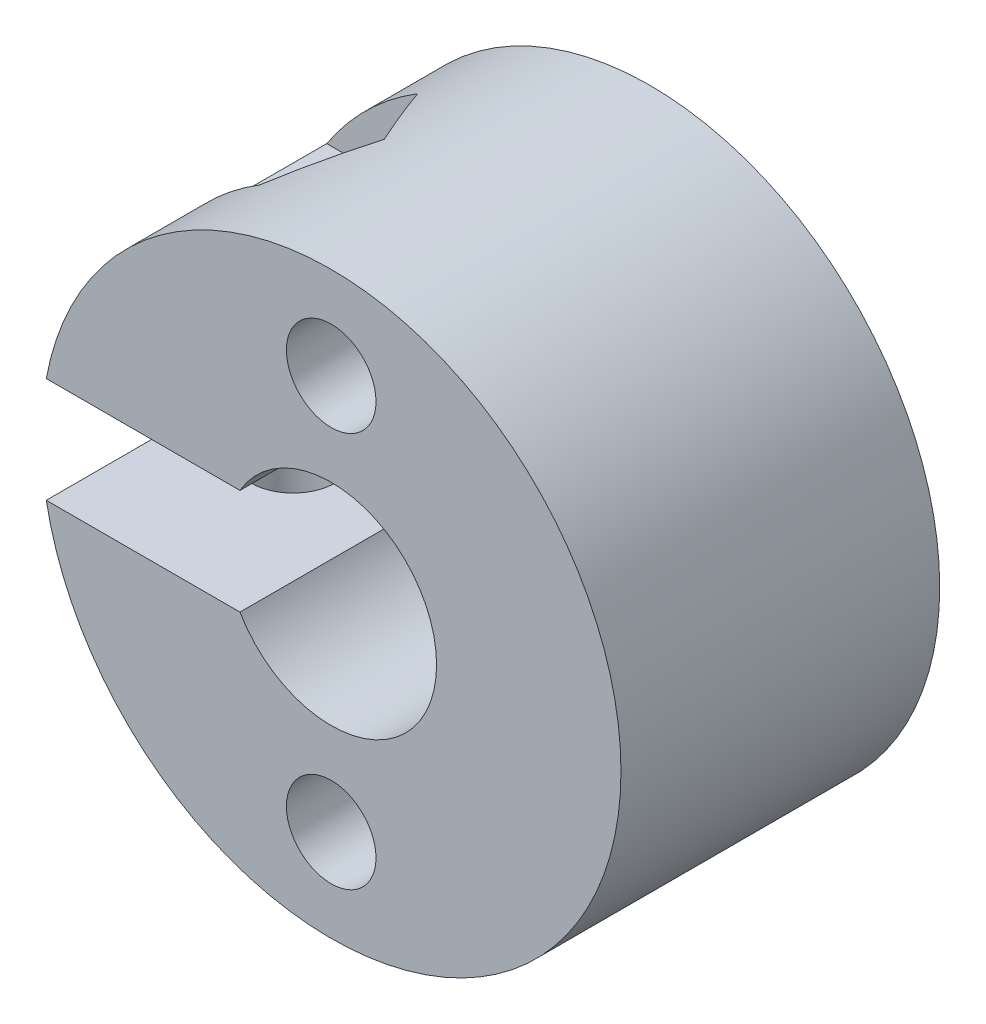
ISO-10303-21;
HEADER;
FILE_DESCRIPTION(('STEP AP214'),'2;1');
FILE_NAME('part.step','',(''),(''),'','','');
FILE_SCHEMA(('AUTOMOTIVE_DESIGN { 1 0 10303 214 1 1 1 1 }'));
ENDSEC;
DATA;
#1=APPLICATION_CONTEXT('core data for automotive mechanical design processes');
#2=APPLICATION_PROTOCOL_DEFINITION('international standard','automotive_design',2000,#1);
#3=PRODUCT_CONTEXT('',#1,'mechanical');
#4=PRODUCT('Part','Part','',(#3));
#5=PRODUCT_RELATED_PRODUCT_CATEGORY('part','',(#4));
#6=PRODUCT_DEFINITION_FORMATION('','',#4);
#7=PRODUCT_DEFINITION_CONTEXT('part definition',#1,'design');
#8=PRODUCT_DEFINITION('design','',#6,#7);
#9=PRODUCT_DEFINITION_SHAPE('','',#8);
#10=(LENGTH_UNIT() NAMED_UNIT(*) SI_UNIT(.MILLI.,.METRE.));
#11=(NAMED_UNIT(*) PLANE_ANGLE_UNIT() SI_UNIT($,.RADIAN.));
#12=(NAMED_UNIT(*) SI_UNIT($,.STERADIAN.) SOLID_ANGLE_UNIT());
#13=UNCERTAINTY_MEASURE_WITH_UNIT(LENGTH_MEASURE(1.E-05),#10,'distance_accuracy_value','');
#14=(GEOMETRIC_REPRESENTATION_CONTEXT(3) GLOBAL_UNCERTAINTY_ASSIGNED_CONTEXT((#13)) GLOBAL_UNIT_ASSIGNED_CONTEXT((#10,
#11,#12)) REPRESENTATION_CONTEXT('',''));
#15=CARTESIAN_POINT('',(0.,0.,0.));
#16=DIRECTION('',(0.,0.,1.));
#17=DIRECTION('',(1.,0.,0.));
#18=AXIS2_PLACEMENT_3D('',#15,#16,#17);
#19=CARTESIAN_POINT('',(0.,0.,6.05));
#20=DIRECTION('',(0.,0.,-1.));
#21=DIRECTION('',(-1.,0.,0.));
#22=AXIS2_PLACEMENT_3D('',#19,#20,#21);
#23=CYLINDRICAL_SURFACE('',#22,11.);
#24=CARTESIAN_POINT('',(0.,0.,-6.99038105676657));
#25=DIRECTION('',(0.866025403784438,0.,0.500000000000001));
#26=DIRECTION('',(0.500000000000001,0.,-0.866025403784438));
#27=AXIS2_PLACEMENT_3D('',#24,#25,#26);
#28=ELLIPSE('',#27,22.,11.);
#29=CARTESIAN_POINT('',(-4.03589838486225,10.2328649080825,0.));
#30=VERTEX_POINT('',#29);
#31=CARTESIAN_POINT('',(-5.76794919243113,9.36647009889708,3.));
#32=VERTEX_POINT('',#31);
#33=EDGE_CURVE('E45',#30,#32,#28,.T.);
#34=ORIENTED_EDGE('',*,*,#33,.T.);
#35=CARTESIAN_POINT('',(0.,0.,3.));
#36=DIRECTION('',(0.,0.,1.));
#37=DIRECTION('',(1.,0.,0.));
#38=AXIS2_PLACEMENT_3D('',#35,#36,#37);
#39=CIRCLE('',#38,11.);
#40=CARTESIAN_POINT('',(-9.21954445729289,6.,3.));
#41=VERTEX_POINT('',#40);
#42=EDGE_CURVE('E11',#32,#41,#39,.T.);
#43=ORIENTED_EDGE('',*,*,#42,.T.);
#44=DIRECTION('',(0.,0.,-1.));
#45=VECTOR('',#44,1.);
#46=CARTESIAN_POINT('',(-9.21954445729289,6.,6.05));
#47=LINE('',#46,#45);
#48=CARTESIAN_POINT('',(-9.21954445729289,6.,-3.));
#49=VERTEX_POINT('',#48);
#50=EDGE_CURVE('E138',#41,#49,#47,.T.);
#51=ORIENTED_EDGE('',*,*,#50,.T.);
#52=CARTESIAN_POINT('',(0.,0.,-3.));
#53=DIRECTION('',(0.,0.,-1.));
#54=DIRECTION('',(-1.,0.,0.));
#55=AXIS2_PLACEMENT_3D('',#52,#53,#54);
#56=CIRCLE('',#55,11.);
#57=CARTESIAN_POINT('',(-5.76794919243112,9.36647009889708,-3.));
#58=VERTEX_POINT('',#57);
#59=EDGE_CURVE('E121',#49,#58,#56,.T.);
#60=ORIENTED_EDGE('',*,*,#59,.T.);
#61=CARTESIAN_POINT('',(0.,0.,6.99038105676659));
#62=DIRECTION('',(0.866025403784439,0.,-0.5));
#63=DIRECTION('',(-0.5,0.,-0.866025403784439));
#64=AXIS2_PLACEMENT_3D('',#61,#62,#63);
#65=ELLIPSE('',#64,22.,11.);
#66=EDGE_CURVE('E114',#58,#30,#65,.T.);
#67=ORIENTED_EDGE('',*,*,#66,.T.);
#68=EDGE_LOOP('',(#34,#43,#51,#60,#67));
#69=FACE_BOUND('',#68,.T.);
#70=CARTESIAN_POINT('',(0.,0.,-6.05));
#71=DIRECTION('',(0.,0.,1.));
#72=DIRECTION('',(1.,0.,0.));
#73=AXIS2_PLACEMENT_3D('',#70,#71,#72);
#74=CIRCLE('',#73,11.);
#75=CARTESIAN_POINT('',(-10.816653826392,-2.,-6.05));
#76=VERTEX_POINT('',#75);
#77=CARTESIAN_POINT('',(-10.816653826392,2.,-6.05));
#78=VERTEX_POINT('',#77);
#79=EDGE_CURVE('E178',#76,#78,#74,.T.);
#80=ORIENTED_EDGE('',*,*,#79,.T.);
#81=DIRECTION('',(0.,0.,-1.));
#82=VECTOR('',#81,1.);
#83=CARTESIAN_POINT('',(-10.816653826392,2.,6.05));
#84=LINE('',#83,#82);
#85=CARTESIAN_POINT('',(-10.816653826392,2.,6.05));
#86=VERTEX_POINT('',#85);
#87=EDGE_CURVE('E183',#86,#78,#84,.T.);
#88=ORIENTED_EDGE('',*,*,#87,.F.);
#89=CARTESIAN_POINT('',(0.,0.,6.05));
#90=DIRECTION('',(0.,0.,1.));
#91=DIRECTION('',(1.,0.,0.));
#92=AXIS2_PLACEMENT_3D('',#89,#90,#91);
#93=CIRCLE('',#92,11.);
#94=CARTESIAN_POINT('',(-10.816653826392,-2.,6.05));
#95=VERTEX_POINT('',#94);
#96=EDGE_CURVE('E168',#95,#86,#93,.T.);
#97=ORIENTED_EDGE('',*,*,#96,.F.);
#98=DIRECTION('',(0.,0.,-1.));
#99=VECTOR('',#98,1.);
#100=CARTESIAN_POINT('',(-10.816653826392,-2.,6.05));
#101=LINE('',#100,#99);
#102=EDGE_CURVE('E186',#95,#76,#101,.T.);
#103=ORIENTED_EDGE('',*,*,#102,.T.);
#104=EDGE_LOOP('',(#80,#88,#97,#103));
#105=FACE_BOUND('',#104,.T.);
#106=CARTESIAN_POINT('',(-9.21954445729289,-6.,-2.45828534946481));
#107=CARTESIAN_POINT('',(-9.16962369434284,-6.07670838822272,-2.49319914837598));
#108=CARTESIAN_POINT('',(-9.11846097288012,-6.15322954997117,-2.52672792055324));
#109=CARTESIAN_POINT('',(-9.01363326079193,-6.30578962097701,-2.59088731650166));
#110=CARTESIAN_POINT('',(-8.95996788693253,-6.38182845433626,-2.62151749421803));
#111=CARTESIAN_POINT('',(-8.79492353272957,-6.60942473448226,-2.70900633348126));
#112=CARTESIAN_POINT('',(-8.67976009867826,-6.76005514058467,-2.76127726455125));
#113=CARTESIAN_POINT('',(-8.43810874825098,-7.05944452733029,-2.85251234749427));
#114=CARTESIAN_POINT('',(-8.31150003565628,-7.20815840092392,-2.89130675590342));
#115=CARTESIAN_POINT('',(-8.04889237043635,-7.50025960626798,-2.95243626562761));
#116=CARTESIAN_POINT('',(-7.91290610561974,-7.64365374649872,-2.97479314687432));
#117=CARTESIAN_POINT('',(-7.60258257874723,-7.95350250591399,-3.00309496073762));
#118=CARTESIAN_POINT('',(-7.42621388634796,-8.11842628589439,-3.00457296913705));
#119=CARTESIAN_POINT('',(-7.1555040531597,-8.35542719544604,-2.98152245214718));
#120=CARTESIAN_POINT('',(-7.06440911402104,-8.43256840696948,-2.96967117161582));
#121=CARTESIAN_POINT('',(-6.88077342278933,-8.58306804930493,-2.93688113199226));
#122=CARTESIAN_POINT('',(-6.78823293183919,-8.65642715329895,-2.91594399639386));
#123=CARTESIAN_POINT('',(-6.54200670910777,-8.8452968450835,-2.84736931550023));
#124=CARTESIAN_POINT('',(-6.38770294522396,-8.957186475267,-2.7912226934624));
#125=CARTESIAN_POINT('',(-6.1592549468863,-9.11439762455724,-2.68504973063589));
#126=CARTESIAN_POINT('',(-6.08354939344028,-9.16506592569123,-2.64596108280181));
#127=CARTESIAN_POINT('',(-5.93398163716762,-9.2626020755329,-2.5602735315391));
#128=CARTESIAN_POINT('',(-5.86011851003812,-9.30947185753941,-2.51367848511796));
#129=CARTESIAN_POINT('',(-5.71453819156496,-9.39954529803598,-2.41247862539532));
#130=CARTESIAN_POINT('',(-5.64284445033294,-9.44271457476713,-2.35780936522533));
#131=CARTESIAN_POINT('',(-5.5033182306326,-9.52470637523183,-2.24087935260187));
#132=CARTESIAN_POINT('',(-5.43548380769459,-9.56353109762215,-2.17862247366111));
#133=CARTESIAN_POINT('',(-5.30471648830957,-9.63667977622062,-2.04678951605906));
#134=CARTESIAN_POINT('',(-5.24178188743467,-9.67100530036345,-1.97721600250212));
#135=CARTESIAN_POINT('',(-5.1218362220198,-9.73506126870522,-1.8311908778656));
#136=CARTESIAN_POINT('',(-5.06482414251262,-9.76479250067438,-1.75474044951573));
#137=CARTESIAN_POINT('',(-4.96521231878609,-9.81577027607118,-1.60675355043185));
#138=CARTESIAN_POINT('',(-4.92171241941144,-9.83762195740379,-1.53602898576591));
#139=CARTESIAN_POINT('',(-4.84036598904372,-9.87790048429394,-1.39043259802364));
#140=CARTESIAN_POINT('',(-4.80252139352554,-9.89632615785693,-1.3155593670678));
#141=CARTESIAN_POINT('',(-4.73303669143421,-9.92974586871033,-1.16231766128789));
#142=CARTESIAN_POINT('',(-4.70139177011898,-9.94474257050634,-1.08395195728736));
#143=CARTESIAN_POINT('',(-4.64468205597193,-9.97135403585391,-0.924310682393318));
#144=CARTESIAN_POINT('',(-4.61961957086766,-9.98296761347579,-0.843034102297617));
#145=CARTESIAN_POINT('',(-4.55829422061439,-10.0111905425589,-0.608987253280262));
#146=CARTESIAN_POINT('',(-4.53028229232096,-10.0238134673388,-0.453458787378516));
#147=CARTESIAN_POINT('',(-4.49909335075869,-10.0378508590196,-0.139537649235302));
#148=CARTESIAN_POINT('',(-4.495911016331,-10.039267727459,0.0188544020260451));
#149=CARTESIAN_POINT('',(-4.5142533014835,-10.0310322063007,0.330261746704096));
#150=CARTESIAN_POINT('',(-4.53521248444752,-10.0216331494081,0.483317004425118));
#151=CARTESIAN_POINT('',(-4.6000254114755,-9.99204788726955,0.78339743154016));
#152=CARTESIAN_POINT('',(-4.64387779238082,-9.97186232429642,0.930422959407877));
#153=CARTESIAN_POINT('',(-4.75275391643018,-9.92043046478622,1.21486583274434));
#154=CARTESIAN_POINT('',(-4.81784229807742,-9.8891503728863,1.35225226736871));
#155=CARTESIAN_POINT('',(-4.96633457249534,-9.81541465728542,1.61341613678729));
#156=CARTESIAN_POINT('',(-5.04973906881889,-9.77295866530689,1.73719312292102));
#157=CARTESIAN_POINT('',(-5.23407143694858,-9.67551810805269,1.97192752401311));
#158=CARTESIAN_POINT('',(-5.33544867094766,-9.62019691227175,2.08239101186931));
#159=CARTESIAN_POINT('',(-5.54965456792145,-9.49823732049181,2.28425812245443));
#160=CARTESIAN_POINT('',(-5.66248591135079,-9.43159627298877,2.37565726844888));
#161=CARTESIAN_POINT('',(-5.90447965518244,-9.28217988126091,2.54515557869029));
#162=CARTESIAN_POINT('',(-6.03422911142344,-9.19855017896628,2.62165487661195));
#163=CARTESIAN_POINT('',(-6.2974218036384,-9.02040658894497,2.75234858377846));
#164=CARTESIAN_POINT('',(-6.43086685103741,-8.92588728920727,2.80653184046526));
#165=CARTESIAN_POINT('',(-6.65956125405633,-8.75582293555542,2.88162398532755));
#166=CARTESIAN_POINT('',(-6.75487876985067,-8.68252776166313,2.90761365881151));
#167=CARTESIAN_POINT('',(-6.94439426011574,-8.53170816218983,2.94969880929382));
#168=CARTESIAN_POINT('',(-7.03859184320766,-8.45418230813817,2.96579092163729));
#169=CARTESIAN_POINT('',(-7.22513790081673,-8.29532556127582,2.98886323729912));
#170=CARTESIAN_POINT('',(-7.31748268816114,-8.21398798438582,2.99582676275173));
#171=CARTESIAN_POINT('',(-7.49953102708978,-8.04811841569375,3.00138225655563));
#172=CARTESIAN_POINT('',(-7.58923385445976,-7.96358556223865,2.99997195054561));
#173=CARTESIAN_POINT('',(-7.79815722750525,-7.75997192436992,2.98759839188977));
#174=CARTESIAN_POINT('',(-7.91601189235662,-7.63968636285029,2.9732919772315));
#175=CARTESIAN_POINT('',(-8.14508319364219,-7.39498106502992,2.93213579965798));
#176=CARTESIAN_POINT('',(-8.25629664956186,-7.27055939162338,2.90528008028371));
#177=CARTESIAN_POINT('',(-8.47158470939219,-7.0185268366963,2.84053805203195));
#178=CARTESIAN_POINT('',(-8.57566043718832,-6.89091646159643,2.80265348467389));
#179=CARTESIAN_POINT('',(-8.77643671905504,-6.63331084674224,2.71709641632918));
#180=CARTESIAN_POINT('',(-8.8731406067424,-6.50331671833403,2.66942837596551));
#181=CARTESIAN_POINT('',(-9.0100708385558,-6.31065626236284,2.5927247193428));
#182=CARTESIAN_POINT('',(-9.05318468137214,-6.2486399815589,2.56712161040548));
#183=CARTESIAN_POINT('',(-9.13765065685103,-6.12445622512442,2.51407607063091));
#184=CARTESIAN_POINT('',(-9.17900701664316,-6.06228954289204,2.48663851586983));
#185=CARTESIAN_POINT('',(-9.21954445729289,-6.,2.45828534946483));
#186=B_SPLINE_CURVE_WITH_KNOTS('',3,(#106,#107,#108,#109,#110,#111,#112,#113,#114,#115,#116,
#117,#118,#119,#120,#121,#122,#123,#124,#125,#126,#127,#128,#129,#130,#131,#132,#133,#134,#135,
#136,#137,#138,#139,#140,#141,#142,#143,#144,#145,#146,#147,#148,#149,#150,#151,#152,#153,#154,
#155,#156,#157,#158,#159,#160,#161,#162,#163,#164,#165,#166,#167,#168,#169,#170,#171,#172,#173,
#174,#175,#176,#177,#178,#179,#180,#181,#182,#183,#184,#185),.UNSPECIFIED.,.F.,.F.,(4,2,2,2,2,2,
2,2,2,2,2,2,2,2,2,2,2,2,2,2,2,2,2,2,2,2,2,2,2,2,2,2,2,2,2,2,2,2,2,4),(0.,0.293830544857458,
0.587706233012701,1.17701105495841,1.77349006790102,2.36917730720555,3.09075390750203,
3.45026298080158,3.80970784213959,4.40296197091337,4.70004981985171,4.99698550040555,
5.29643404313603,5.59573035141063,5.89492207841636,6.19406244680553,6.45129720470754,
6.70861979816422,6.96574175263062,7.22295373117318,7.69601695406956,8.16897879336186,
8.6310844606701,9.09316261537365,9.55666058192806,10.0201738239659,10.4975452881344,
10.9750287239287,11.489866590444,12.0049614385793,12.3735467746423,12.7422573413522,
13.1116406052247,13.4811241994459,13.9873880513941,14.4938924431786,15.0003168983071,
15.5065109679393,15.7457327489761,15.9843421684413),.UNSPECIFIED.);
#187=CARTESIAN_POINT('',(-9.21954445729289,-6.,-2.45828534946481));
#188=VERTEX_POINT('',#187);
#189=CARTESIAN_POINT('',(-9.21954445729289,-6.,2.45828534946481));
#190=VERTEX_POINT('',#189);
#191=EDGE_CURVE('E190',#188,#190,#186,.T.);
#192=ORIENTED_EDGE('',*,*,#191,.F.);
#193=DIRECTION('',(0.,0.,-1.));
#194=VECTOR('',#193,1.);
#195=CARTESIAN_POINT('',(-9.21954445729289,-6.,6.05));
#196=LINE('',#195,#194);
#197=EDGE_CURVE('E142',#190,#188,#196,.T.);
#198=ORIENTED_EDGE('',*,*,#197,.F.);
#199=EDGE_LOOP('',(#192,#198));
#200=FACE_BOUND('',#199,.T.);
#201=ADVANCED_FACE('F37',(#69,#105,#200),#23,.T.);
#202=CARTESIAN_POINT('',(-7.5,-12.5,0.));
#203=DIRECTION('',(0.,1.,0.));
#204=DIRECTION('',(0.,0.,1.));
#205=AXIS2_PLACEMENT_3D('',#202,#203,#204);
#206=CYLINDRICAL_SURFACE('',#205,1.6);
#207=CARTESIAN_POINT('',(-7.5,-2.,0.));
#208=DIRECTION('',(0.,1.,0.));
#209=DIRECTION('',(0.,0.,1.));
#210=AXIS2_PLACEMENT_3D('',#207,#208,#209);
#211=CIRCLE('',#210,1.6);
#212=CARTESIAN_POINT('',(-7.5,-2.,1.6));
#213=VERTEX_POINT('',#212);
#214=EDGE_CURVE('E157',#213,#213,#211,.T.);
#215=ORIENTED_EDGE('',*,*,#214,.T.);
#216=EDGE_LOOP('',(#215));
#217=FACE_BOUND('',#216,.T.);
#218=CARTESIAN_POINT('',(-7.5,-6.,0.));
#219=DIRECTION('',(0.,-1.,0.));
#220=DIRECTION('',(0.,0.,-1.));
#221=AXIS2_PLACEMENT_3D('',#218,#219,#220);
#222=CIRCLE('',#221,1.6);
#223=CARTESIAN_POINT('',(-7.5,-6.,-1.6));
#224=VERTEX_POINT('',#223);
#225=EDGE_CURVE('E141',#224,#224,#222,.F.);
#226=ORIENTED_EDGE('',*,*,#225,.F.);
#227=EDGE_LOOP('',(#226));
#228=FACE_BOUND('',#227,.T.);
#229=ADVANCED_FACE('F222',(#217,#228),#206,.F.);
#230=CARTESIAN_POINT('',(0.,0.,6.05));
#231=DIRECTION('',(0.,0.,-1.));
#232=DIRECTION('',(-1.,0.,0.));
#233=AXIS2_PLACEMENT_3D('',#230,#231,#232);
#234=CYLINDRICAL_SURFACE('',#233,4.);
#235=CARTESIAN_POINT('',(0.,0.,-6.05));
#236=DIRECTION('',(0.,0.,1.));
#237=DIRECTION('',(1.,0.,0.));
#238=AXIS2_PLACEMENT_3D('',#235,#236,#237);
#239=CIRCLE('',#238,4.);
#240=CARTESIAN_POINT('',(-3.46410161513775,-2.,-6.05));
#241=VERTEX_POINT('',#240);
#242=CARTESIAN_POINT('',(-3.46410161513775,2.,-6.05));
#243=VERTEX_POINT('',#242);
#244=EDGE_CURVE('E160',#241,#243,#239,.T.);
#245=ORIENTED_EDGE('',*,*,#244,.F.);
#246=DIRECTION('',(0.,0.,-1.));
#247=VECTOR('',#246,1.);
#248=CARTESIAN_POINT('',(-3.46410161513775,-2.,6.05));
#249=LINE('',#248,#247);
#250=CARTESIAN_POINT('',(-3.46410161513775,-2.,6.05));
#251=VERTEX_POINT('',#250);
#252=EDGE_CURVE('E188',#251,#241,#249,.T.);
#253=ORIENTED_EDGE('',*,*,#252,.F.);
#254=CARTESIAN_POINT('',(0.,0.,6.05));
#255=DIRECTION('',(0.,0.,1.));
#256=DIRECTION('',(1.,0.,0.));
#257=AXIS2_PLACEMENT_3D('',#254,#255,#256);
#258=CIRCLE('',#257,4.);
#259=CARTESIAN_POINT('',(-3.46410161513775,2.,6.05));
#260=VERTEX_POINT('',#259);
#261=EDGE_CURVE('E161',#251,#260,#258,.T.);
#262=ORIENTED_EDGE('',*,*,#261,.T.);
#263=DIRECTION('',(0.,0.,-1.));
#264=VECTOR('',#263,1.);
#265=CARTESIAN_POINT('',(-3.46410161513775,2.,6.05));
#266=LINE('',#265,#264);
#267=EDGE_CURVE('E172',#260,#243,#266,.T.);
#268=ORIENTED_EDGE('',*,*,#267,.T.);
#269=EDGE_LOOP('',(#245,#253,#262,#268));
#270=FACE_BOUND('',#269,.T.);
#271=ADVANCED_FACE('F39',(#270),#234,.F.);
#272=CARTESIAN_POINT('',(0.,-2.,6.05));
#273=DIRECTION('',(0.,1.,0.));
#274=DIRECTION('',(0.,0.,1.));
#275=AXIS2_PLACEMENT_3D('',#272,#273,#274);
#276=PLANE('',#275);
#277=ORIENTED_EDGE('',*,*,#214,.F.);
#278=EDGE_LOOP('',(#277));
#279=FACE_BOUND('',#278,.T.);
#280=DIRECTION('',(1.,0.,0.));
#281=VECTOR('',#280,1.);
#282=CARTESIAN_POINT('',(0.,-2.,-6.05));
#283=LINE('',#282,#281);
#284=EDGE_CURVE('E175',#76,#241,#283,.T.);
#285=ORIENTED_EDGE('',*,*,#284,.F.);
#286=ORIENTED_EDGE('',*,*,#102,.F.);
#287=DIRECTION('',(1.,0.,0.));
#288=VECTOR('',#287,1.);
#289=CARTESIAN_POINT('',(0.,-2.,6.05));
#290=LINE('',#289,#288);
#291=EDGE_CURVE('E164',#95,#251,#290,.T.);
#292=ORIENTED_EDGE('',*,*,#291,.T.);
#293=ORIENTED_EDGE('',*,*,#252,.T.);
#294=EDGE_LOOP('',(#285,#286,#292,#293));
#295=FACE_BOUND('',#294,.T.);
#296=ADVANCED_FACE('F235',(#279,#295),#276,.T.);
#297=CARTESIAN_POINT('',(0.,2.,6.05));
#298=DIRECTION('',(0.,1.,0.));
#299=DIRECTION('',(0.,0.,1.));
#300=AXIS2_PLACEMENT_3D('',#297,#298,#299);
#301=PLANE('',#300);
#302=CARTESIAN_POINT('',(-7.5,2.,0.));
#303=DIRECTION('',(0.,1.,0.));
#304=DIRECTION('',(0.,0.,1.));
#305=AXIS2_PLACEMENT_3D('',#302,#303,#304);
#306=CIRCLE('',#305,1.6);
#307=CARTESIAN_POINT('',(-7.5,2.,1.6));
#308=VERTEX_POINT('',#307);
#309=EDGE_CURVE('E156',#308,#308,#306,.T.);
#310=ORIENTED_EDGE('',*,*,#309,.T.);
#311=EDGE_LOOP('',(#310));
#312=FACE_BOUND('',#311,.T.);
#313=DIRECTION('',(1.,0.,0.));
#314=VECTOR('',#313,1.);
#315=CARTESIAN_POINT('',(0.,2.,-6.05));
#316=LINE('',#315,#314);
#317=EDGE_CURVE('E165',#78,#243,#316,.T.);
#318=ORIENTED_EDGE('',*,*,#317,.T.);
#319=ORIENTED_EDGE('',*,*,#267,.F.);
#320=DIRECTION('',(1.,0.,0.));
#321=VECTOR('',#320,1.);
#322=CARTESIAN_POINT('',(0.,2.,6.05));
#323=LINE('',#322,#321);
#324=EDGE_CURVE('E170',#86,#260,#323,.T.);
#325=ORIENTED_EDGE('',*,*,#324,.F.);
#326=ORIENTED_EDGE('',*,*,#87,.T.);
#327=EDGE_LOOP('',(#318,#319,#325,#326));
#328=FACE_BOUND('',#327,.T.);
#329=ADVANCED_FACE('F230',(#312,#328),#301,.F.);
#330=CARTESIAN_POINT('',(0.,0.,6.05));
#331=DIRECTION('',(0.,0.,1.));
#332=DIRECTION('',(1.,0.,0.));
#333=AXIS2_PLACEMENT_3D('',#330,#331,#332);
#334=PLANE('',#333);
#335=CARTESIAN_POINT('',(0.,7.5,6.05));
#336=DIRECTION('',(0.,0.,1.));
#337=DIRECTION('',(1.,0.,0.));
#338=AXIS2_PLACEMENT_3D('',#335,#336,#337);
#339=CIRCLE('',#338,1.7);
#340=CARTESIAN_POINT('',(1.70000000000003,7.5,6.05));
#341=VERTEX_POINT('',#340);
#342=EDGE_CURVE('E153',#341,#341,#339,.T.);
#343=ORIENTED_EDGE('',*,*,#342,.F.);
#344=EDGE_LOOP('',(#343));
#345=FACE_BOUND('',#344,.T.);
#346=CARTESIAN_POINT('',(0.,-7.5,6.05));
#347=DIRECTION('',(0.,0.,1.));
#348=DIRECTION('',(1.,0.,0.));
#349=AXIS2_PLACEMENT_3D('',#346,#347,#348);
#350=CIRCLE('',#349,1.7);
#351=CARTESIAN_POINT('',(1.69999999999992,-7.5,6.05));
#352=VERTEX_POINT('',#351);
#353=EDGE_CURVE('E148',#352,#352,#350,.T.);
#354=ORIENTED_EDGE('',*,*,#353,.F.);
#355=EDGE_LOOP('',(#354));
#356=FACE_BOUND('',#355,.T.);
#357=ORIENTED_EDGE('',*,*,#261,.F.);
#358=ORIENTED_EDGE('',*,*,#291,.F.);
#359=ORIENTED_EDGE('',*,*,#96,.T.);
#360=ORIENTED_EDGE('',*,*,#324,.T.);
#361=EDGE_LOOP('',(#357,#358,#359,#360));
#362=FACE_BOUND('',#361,.T.);
#363=ADVANCED_FACE('F226',(#345,#356,#362),#334,.T.);
#364=CARTESIAN_POINT('',(0.,0.,-6.05));
#365=DIRECTION('',(0.,0.,1.));
#366=DIRECTION('',(1.,0.,0.));
#367=AXIS2_PLACEMENT_3D('',#364,#365,#366);
#368=PLANE('',#367);
#369=CARTESIAN_POINT('',(0.,7.5,-6.05));
#370=DIRECTION('',(0.,0.,-1.));
#371=DIRECTION('',(-1.,0.,0.));
#372=AXIS2_PLACEMENT_3D('',#369,#370,#371);
#373=CIRCLE('',#372,1.7);
#374=CARTESIAN_POINT('',(-1.69999999999997,7.5,-6.05));
#375=VERTEX_POINT('',#374);
#376=EDGE_CURVE('E145',#375,#375,#373,.T.);
#377=ORIENTED_EDGE('',*,*,#376,.F.);
#378=EDGE_LOOP('',(#377));
#379=FACE_BOUND('',#378,.T.);
#380=CARTESIAN_POINT('',(0.,-7.5,-6.05));
#381=DIRECTION('',(0.,0.,-1.));
#382=DIRECTION('',(-1.,0.,0.));
#383=AXIS2_PLACEMENT_3D('',#380,#381,#382);
#384=CIRCLE('',#383,1.7);
#385=CARTESIAN_POINT('',(-1.70000000000008,-7.5,-6.05));
#386=VERTEX_POINT('',#385);
#387=EDGE_CURVE('E144',#386,#386,#384,.T.);
#388=ORIENTED_EDGE('',*,*,#387,.F.);
#389=EDGE_LOOP('',(#388));
#390=FACE_BOUND('',#389,.T.);
#391=ORIENTED_EDGE('',*,*,#244,.T.);
#392=ORIENTED_EDGE('',*,*,#317,.F.);
#393=ORIENTED_EDGE('',*,*,#79,.F.);
#394=ORIENTED_EDGE('',*,*,#284,.T.);
#395=EDGE_LOOP('',(#391,#392,#393,#394));
#396=FACE_BOUND('',#395,.T.);
#397=ADVANCED_FACE('F229',(#379,#390,#396),#368,.F.);
#398=CARTESIAN_POINT('',(-7.5,6.,0.));
#399=DIRECTION('',(0.,-1.,0.));
#400=DIRECTION('',(0.,0.,-1.));
#401=AXIS2_PLACEMENT_3D('',#398,#399,#400);
#402=CIRCLE('',#401,1.6);
#403=CARTESIAN_POINT('',(-7.5,6.,-1.6));
#404=VERTEX_POINT('',#403);
#405=EDGE_CURVE('E136',#404,#404,#402,.F.);
#406=ORIENTED_EDGE('',*,*,#405,.T.);
#407=EDGE_LOOP('',(#406));
#408=FACE_BOUND('',#407,.T.);
#409=ORIENTED_EDGE('',*,*,#309,.F.);
#410=EDGE_LOOP('',(#409));
#411=FACE_BOUND('',#410,.T.);
#412=ADVANCED_FACE('F220',(#408,#411),#206,.F.);
#413=CARTESIAN_POINT('',(0.,-7.5,18.95));
#414=DIRECTION('',(0.,0.,-1.));
#415=DIRECTION('',(-1.,0.,0.));
#416=AXIS2_PLACEMENT_3D('',#413,#414,#415);
#417=CYLINDRICAL_SURFACE('',#416,1.7);
#418=ORIENTED_EDGE('',*,*,#353,.T.);
#419=EDGE_LOOP('',(#418));
#420=FACE_BOUND('',#419,.T.);
#421=ORIENTED_EDGE('',*,*,#387,.T.);
#422=EDGE_LOOP('',(#421));
#423=FACE_BOUND('',#422,.T.);
#424=ADVANCED_FACE('F216',(#420,#423),#417,.F.);
#425=CARTESIAN_POINT('',(0.,7.5,18.95));
#426=DIRECTION('',(0.,0.,-1.));
#427=DIRECTION('',(-1.,0.,0.));
#428=AXIS2_PLACEMENT_3D('',#425,#426,#427);
#429=CYLINDRICAL_SURFACE('',#428,1.7);
#430=ORIENTED_EDGE('',*,*,#342,.T.);
#431=EDGE_LOOP('',(#430));
#432=FACE_BOUND('',#431,.T.);
#433=ORIENTED_EDGE('',*,*,#376,.T.);
#434=EDGE_LOOP('',(#433));
#435=FACE_BOUND('',#434,.T.);
#436=ADVANCED_FACE('F211',(#432,#435),#429,.F.);
#437=CARTESIAN_POINT('',(-7.5,-16.,0.));
#438=DIRECTION('',(0.,1.,0.));
#439=DIRECTION('',(0.,0.,1.));
#440=AXIS2_PLACEMENT_3D('',#437,#438,#439);
#441=CYLINDRICAL_SURFACE('',#440,3.);
#442=ORIENTED_EDGE('',*,*,#191,.T.);
#443=CARTESIAN_POINT('',(-7.5,-6.,0.));
#444=DIRECTION('',(0.,-1.,0.));
#445=DIRECTION('',(0.,0.,-1.));
#446=AXIS2_PLACEMENT_3D('',#443,#444,#445);
#447=CIRCLE('',#446,3.);
#448=EDGE_CURVE('E59',#188,#190,#447,.T.);
#449=ORIENTED_EDGE('',*,*,#448,.F.);
#450=EDGE_LOOP('',(#442,#449));
#451=FACE_BOUND('',#450,.T.);
#452=ADVANCED_FACE('F205',(#451),#441,.F.);
#453=CARTESIAN_POINT('',(-7.5,-6.,0.));
#454=DIRECTION('',(0.,-1.,0.));
#455=DIRECTION('',(0.,0.,-1.));
#456=AXIS2_PLACEMENT_3D('',#453,#454,#455);
#457=PLANE('',#456);
#458=ORIENTED_EDGE('',*,*,#225,.T.);
#459=EDGE_LOOP('',(#458));
#460=FACE_BOUND('',#459,.T.);
#461=ORIENTED_EDGE('',*,*,#197,.T.);
#462=ORIENTED_EDGE('',*,*,#448,.T.);
#463=EDGE_LOOP('',(#461,#462));
#464=FACE_BOUND('',#463,.T.);
#465=ADVANCED_FACE('F210',(#460,#464),#457,.T.);
#466=CARTESIAN_POINT('',(-5.76794919243113,16.,3.));
#467=DIRECTION('',(0.,0.,1.));
#468=DIRECTION('',(1.,0.,0.));
#469=AXIS2_PLACEMENT_3D('',#466,#467,#468);
#470=PLANE('',#469);
#471=DIRECTION('',(0.,-1.,0.));
#472=VECTOR('',#471,1.);
#473=CARTESIAN_POINT('',(-5.76794919243113,16.,3.));
#474=LINE('',#473,#472);
#475=CARTESIAN_POINT('',(-5.76794919243113,6.,3.));
#476=VERTEX_POINT('',#475);
#477=EDGE_CURVE('E134',#32,#476,#474,.T.);
#478=ORIENTED_EDGE('',*,*,#477,.T.);
#479=DIRECTION('',(-1.,0.,0.));
#480=VECTOR('',#479,1.);
#481=CARTESIAN_POINT('',(-5.76794919243113,6.,3.));
#482=LINE('',#481,#480);
#483=EDGE_CURVE('E118',#476,#41,#482,.T.);
#484=ORIENTED_EDGE('',*,*,#483,.T.);
#485=ORIENTED_EDGE('',*,*,#42,.F.);
#486=EDGE_LOOP('',(#478,#484,#485));
#487=FACE_BOUND('',#486,.T.);
#488=ADVANCED_FACE('F254',(#487),#470,.F.);
#489=CARTESIAN_POINT('',(-4.03589838486225,16.,0.));
#490=DIRECTION('',(0.866025403784438,0.,0.500000000000001));
#491=DIRECTION('',(0.500000000000001,0.,-0.866025403784438));
#492=AXIS2_PLACEMENT_3D('',#489,#490,#491);
#493=PLANE('',#492);
#494=DIRECTION('',(0.,-1.,0.));
#495=VECTOR('',#494,1.);
#496=CARTESIAN_POINT('',(-4.03589838486225,16.,0.));
#497=LINE('',#496,#495);
#498=CARTESIAN_POINT('',(-4.03589838486225,6.,0.));
#499=VERTEX_POINT('',#498);
#500=EDGE_CURVE('E117',#30,#499,#497,.T.);
#501=ORIENTED_EDGE('',*,*,#500,.T.);
#502=DIRECTION('',(-0.500000000000001,0.,0.866025403784438));
#503=VECTOR('',#502,1.);
#504=CARTESIAN_POINT('',(-4.03589838486225,6.,0.));
#505=LINE('',#504,#503);
#506=EDGE_CURVE('E128',#499,#476,#505,.T.);
#507=ORIENTED_EDGE('',*,*,#506,.T.);
#508=ORIENTED_EDGE('',*,*,#477,.F.);
#509=ORIENTED_EDGE('',*,*,#33,.F.);
#510=EDGE_LOOP('',(#501,#507,#508,#509));
#511=FACE_BOUND('',#510,.T.);
#512=ADVANCED_FACE('F259',(#511),#493,.F.);
#513=CARTESIAN_POINT('',(-5.76794919243112,16.,-3.));
#514=DIRECTION('',(0.866025403784439,0.,-0.5));
#515=DIRECTION('',(-0.5,0.,-0.866025403784439));
#516=AXIS2_PLACEMENT_3D('',#513,#514,#515);
#517=PLANE('',#516);
#518=DIRECTION('',(0.,-1.,0.));
#519=VECTOR('',#518,1.);
#520=CARTESIAN_POINT('',(-5.76794919243112,16.,-3.));
#521=LINE('',#520,#519);
#522=CARTESIAN_POINT('',(-5.76794919243112,6.,-3.));
#523=VERTEX_POINT('',#522);
#524=EDGE_CURVE('E109',#58,#523,#521,.T.);
#525=ORIENTED_EDGE('',*,*,#524,.T.);
#526=DIRECTION('',(0.5,0.,0.866025403784439));
#527=VECTOR('',#526,1.);
#528=CARTESIAN_POINT('',(-5.76794919243112,6.,-3.));
#529=LINE('',#528,#527);
#530=EDGE_CURVE('E112',#523,#499,#529,.T.);
#531=ORIENTED_EDGE('',*,*,#530,.T.);
#532=ORIENTED_EDGE('',*,*,#500,.F.);
#533=ORIENTED_EDGE('',*,*,#66,.F.);
#534=EDGE_LOOP('',(#525,#531,#532,#533));
#535=FACE_BOUND('',#534,.T.);
#536=ADVANCED_FACE('F110',(#535),#517,.F.);
#537=CARTESIAN_POINT('',(-9.23205080756888,16.,-3.));
#538=DIRECTION('',(0.,0.,-1.));
#539=DIRECTION('',(-1.,0.,0.));
#540=AXIS2_PLACEMENT_3D('',#537,#538,#539);
#541=PLANE('',#540);
#542=DIRECTION('',(1.,0.,0.));
#543=VECTOR('',#542,1.);
#544=CARTESIAN_POINT('',(-9.23205080756888,6.,-3.));
#545=LINE('',#544,#543);
#546=EDGE_CURVE('E52',#49,#523,#545,.T.);
#547=ORIENTED_EDGE('',*,*,#546,.T.);
#548=ORIENTED_EDGE('',*,*,#524,.F.);
#549=ORIENTED_EDGE('',*,*,#59,.F.);
#550=EDGE_LOOP('',(#547,#548,#549));
#551=FACE_BOUND('',#550,.T.);
#552=ADVANCED_FACE('F120',(#551),#541,.F.);
#553=CARTESIAN_POINT('',(0.,6.,0.));
#554=DIRECTION('',(0.,-1.,0.));
#555=DIRECTION('',(0.,0.,-1.));
#556=AXIS2_PLACEMENT_3D('',#553,#554,#555);
#557=PLANE('',#556);
#558=ORIENTED_EDGE('',*,*,#405,.F.);
#559=EDGE_LOOP('',(#558));
#560=FACE_BOUND('',#559,.T.);
#561=ORIENTED_EDGE('',*,*,#483,.F.);
#562=ORIENTED_EDGE('',*,*,#506,.F.);
#563=ORIENTED_EDGE('',*,*,#530,.F.);
#564=ORIENTED_EDGE('',*,*,#546,.F.);
#565=ORIENTED_EDGE('',*,*,#50,.F.);
#566=EDGE_LOOP('',(#561,#562,#563,#564,#565));
#567=FACE_BOUND('',#566,.T.);
#568=ADVANCED_FACE('F126',(#560,#567),#557,.F.);
#569=CLOSED_SHELL('',(#201,#229,#271,#296,#329,#363,#397,#412,#424,#436,#452,#465,#488,#512,
#536,#552,#568));
#570=MANIFOLD_SOLID_BREP('B2',#569);
#571=ADVANCED_BREP_SHAPE_REPRESENTATION('',(#18,#570),#14);
#572=SHAPE_DEFINITION_REPRESENTATION(#9,#571);
ENDSEC;
END-ISO-10303-21;
